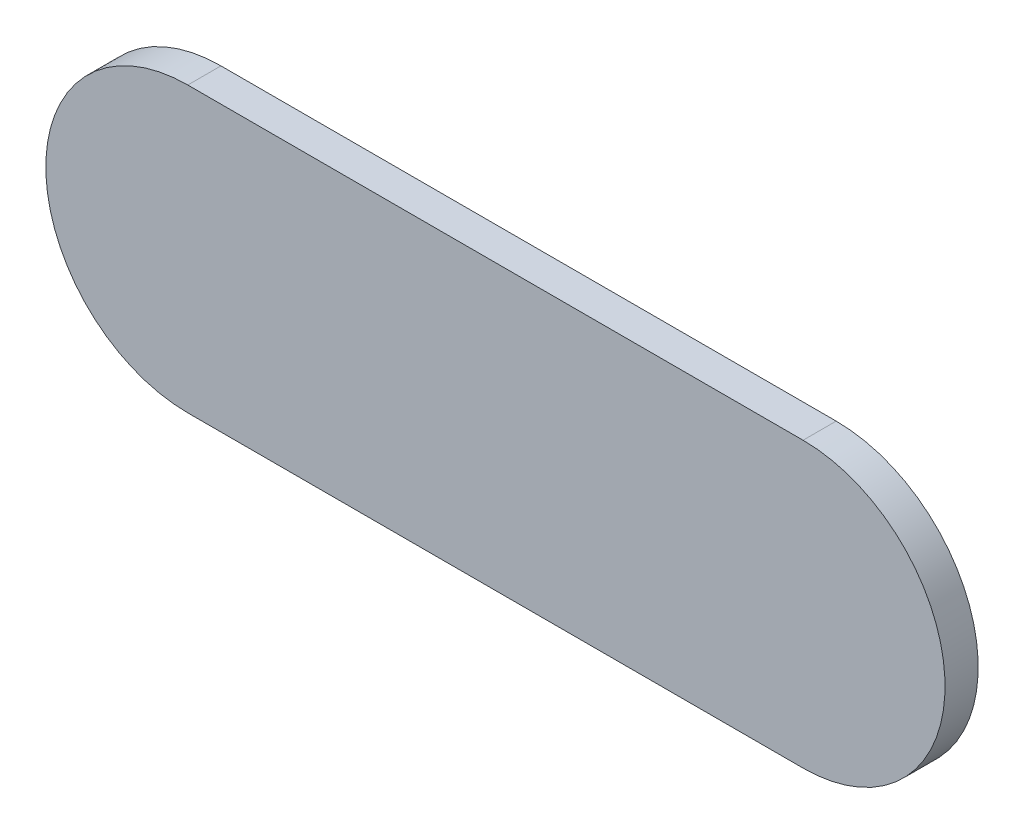
ISO-10303-21;
HEADER;
FILE_DESCRIPTION(('STEP AP214'),'2;1');
FILE_NAME('part.step','',(''),(''),'','','');
FILE_SCHEMA(('AUTOMOTIVE_DESIGN { 1 0 10303 214 1 1 1 1 }'));
ENDSEC;
DATA;
#1=APPLICATION_CONTEXT('core data for automotive mechanical design processes');
#2=APPLICATION_PROTOCOL_DEFINITION('international standard','automotive_design',2000,#1);
#3=PRODUCT_CONTEXT('',#1,'mechanical');
#4=PRODUCT('Part','Part','',(#3));
#5=PRODUCT_RELATED_PRODUCT_CATEGORY('part','',(#4));
#6=PRODUCT_DEFINITION_FORMATION('','',#4);
#7=PRODUCT_DEFINITION_CONTEXT('part definition',#1,'design');
#8=PRODUCT_DEFINITION('design','',#6,#7);
#9=PRODUCT_DEFINITION_SHAPE('','',#8);
#10=(LENGTH_UNIT() NAMED_UNIT(*) SI_UNIT(.MILLI.,.METRE.));
#11=(NAMED_UNIT(*) PLANE_ANGLE_UNIT() SI_UNIT($,.RADIAN.));
#12=(NAMED_UNIT(*) SI_UNIT($,.STERADIAN.) SOLID_ANGLE_UNIT());
#13=UNCERTAINTY_MEASURE_WITH_UNIT(LENGTH_MEASURE(1.E-05),#10,'distance_accuracy_value','');
#14=(GEOMETRIC_REPRESENTATION_CONTEXT(3) GLOBAL_UNCERTAINTY_ASSIGNED_CONTEXT((#13)) GLOBAL_UNIT_ASSIGNED_CONTEXT((#10,
#11,#12)) REPRESENTATION_CONTEXT('',''));
#15=CARTESIAN_POINT('',(0.,0.,0.));
#16=DIRECTION('',(0.,0.,1.));
#17=DIRECTION('',(1.,0.,0.));
#18=AXIS2_PLACEMENT_3D('',#15,#16,#17);
#19=CARTESIAN_POINT('',(133.818,-117.904,1.635));
#20=DIRECTION('',(0.,0.,1.));
#21=DIRECTION('',(1.,0.,0.));
#22=AXIS2_PLACEMENT_3D('',#19,#20,#21);
#23=PLANE('',#22);
#24=DIRECTION('',(-1.,0.,0.));
#25=VECTOR('',#24,1.);
#26=CARTESIAN_POINT('',(133.818,-117.904,1.635));
#27=LINE('',#26,#25);
#28=CARTESIAN_POINT('',(133.818,-117.904,1.635));
#29=VERTEX_POINT('',#28);
#30=CARTESIAN_POINT('',(133.168,-117.904,1.635));
#31=VERTEX_POINT('',#30);
#32=EDGE_CURVE('E82',#29,#31,#27,.T.);
#33=ORIENTED_EDGE('',*,*,#32,.T.);
#34=CARTESIAN_POINT('',(133.168,-118.054,1.635));
#35=DIRECTION('',(0.,0.,1.));
#36=DIRECTION('',(0.,1.,0.));
#37=AXIS2_PLACEMENT_3D('',#34,#35,#36);
#38=CIRCLE('',#37,0.15);
#39=CARTESIAN_POINT('',(133.168,-118.204,1.635));
#40=VERTEX_POINT('',#39);
#41=EDGE_CURVE('E99',#31,#40,#38,.T.);
#42=ORIENTED_EDGE('',*,*,#41,.T.);
#43=DIRECTION('',(1.,0.,0.));
#44=VECTOR('',#43,1.);
#45=CARTESIAN_POINT('',(133.168,-118.204,1.635));
#46=LINE('',#45,#44);
#47=CARTESIAN_POINT('',(133.818,-118.204,1.635));
#48=VERTEX_POINT('',#47);
#49=EDGE_CURVE('E75',#40,#48,#46,.T.);
#50=ORIENTED_EDGE('',*,*,#49,.T.);
#51=CARTESIAN_POINT('',(133.818,-118.054,1.635));
#52=DIRECTION('',(0.,0.,1.));
#53=DIRECTION('',(1.894780628694E-13,-1.,0.));
#54=AXIS2_PLACEMENT_3D('',#51,#52,#53);
#55=CIRCLE('',#54,0.15);
#56=EDGE_CURVE('E11',#48,#29,#55,.T.);
#57=ORIENTED_EDGE('',*,*,#56,.T.);
#58=EDGE_LOOP('',(#33,#42,#50,#57));
#59=FACE_BOUND('',#58,.T.);
#60=ADVANCED_FACE('F17',(#59),#23,.T.);
#61=CARTESIAN_POINT('',(133.818,-117.904,1.6));
#62=DIRECTION('',(0.,0.,1.));
#63=DIRECTION('',(1.,0.,0.));
#64=AXIS2_PLACEMENT_3D('',#61,#62,#63);
#65=PLANE('',#64);
#66=CARTESIAN_POINT('',(133.818,-118.054,1.6));
#67=DIRECTION('',(0.,0.,1.));
#68=DIRECTION('',(1.894780628694E-13,-1.,0.));
#69=AXIS2_PLACEMENT_3D('',#66,#67,#68);
#70=CIRCLE('',#69,0.15);
#71=CARTESIAN_POINT('',(133.818,-118.204,1.6));
#72=VERTEX_POINT('',#71);
#73=CARTESIAN_POINT('',(133.818,-117.904,1.6));
#74=VERTEX_POINT('',#73);
#75=EDGE_CURVE('E20',#72,#74,#70,.T.);
#76=ORIENTED_EDGE('',*,*,#75,.F.);
#77=DIRECTION('',(1.,0.,0.));
#78=VECTOR('',#77,1.);
#79=CARTESIAN_POINT('',(133.168,-118.204,1.6));
#80=LINE('',#79,#78);
#81=CARTESIAN_POINT('',(133.168,-118.204,1.6));
#82=VERTEX_POINT('',#81);
#83=EDGE_CURVE('E102',#82,#72,#80,.T.);
#84=ORIENTED_EDGE('',*,*,#83,.F.);
#85=CARTESIAN_POINT('',(133.168,-118.054,1.6));
#86=DIRECTION('',(0.,0.,1.));
#87=DIRECTION('',(0.,1.,0.));
#88=AXIS2_PLACEMENT_3D('',#85,#86,#87);
#89=CIRCLE('',#88,0.15);
#90=CARTESIAN_POINT('',(133.168,-117.904,1.6));
#91=VERTEX_POINT('',#90);
#92=EDGE_CURVE('E84',#91,#82,#89,.T.);
#93=ORIENTED_EDGE('',*,*,#92,.F.);
#94=DIRECTION('',(-1.,0.,0.));
#95=VECTOR('',#94,1.);
#96=CARTESIAN_POINT('',(133.818,-117.904,1.6));
#97=LINE('',#96,#95);
#98=EDGE_CURVE('E80',#74,#91,#97,.T.);
#99=ORIENTED_EDGE('',*,*,#98,.F.);
#100=EDGE_LOOP('',(#76,#84,#93,#99));
#101=FACE_BOUND('',#100,.T.);
#102=ADVANCED_FACE('F86',(#101),#65,.F.);
#103=CARTESIAN_POINT('',(133.818,-118.054,1.6));
#104=DIRECTION('',(0.,0.,-1.));
#105=DIRECTION('',(1.894780628694E-13,-1.,0.));
#106=AXIS2_PLACEMENT_3D('',#103,#104,#105);
#107=CYLINDRICAL_SURFACE('',#106,0.15);
#108=ORIENTED_EDGE('',*,*,#75,.T.);
#109=DIRECTION('',(0.,0.,1.));
#110=VECTOR('',#109,1.);
#111=CARTESIAN_POINT('',(133.818,-117.904,1.6));
#112=LINE('',#111,#110);
#113=EDGE_CURVE('E69',#74,#29,#112,.T.);
#114=ORIENTED_EDGE('',*,*,#113,.T.);
#115=ORIENTED_EDGE('',*,*,#56,.F.);
#116=DIRECTION('',(0.,0.,1.));
#117=VECTOR('',#116,1.);
#118=CARTESIAN_POINT('',(133.818,-118.204,1.6));
#119=LINE('',#118,#117);
#120=EDGE_CURVE('E72',#72,#48,#119,.T.);
#121=ORIENTED_EDGE('',*,*,#120,.F.);
#122=EDGE_LOOP('',(#108,#114,#115,#121));
#123=FACE_BOUND('',#122,.T.);
#124=ADVANCED_FACE('F68',(#123),#107,.T.);
#125=CARTESIAN_POINT('',(133.168,-118.204,1.6));
#126=DIRECTION('',(0.,1.,0.));
#127=DIRECTION('',(1.,0.,0.));
#128=AXIS2_PLACEMENT_3D('',#125,#126,#127);
#129=PLANE('',#128);
#130=ORIENTED_EDGE('',*,*,#83,.T.);
#131=ORIENTED_EDGE('',*,*,#120,.T.);
#132=ORIENTED_EDGE('',*,*,#49,.F.);
#133=DIRECTION('',(0.,0.,1.));
#134=VECTOR('',#133,1.);
#135=CARTESIAN_POINT('',(133.168,-118.204,1.6));
#136=LINE('',#135,#134);
#137=EDGE_CURVE('E103',#82,#40,#136,.T.);
#138=ORIENTED_EDGE('',*,*,#137,.F.);
#139=EDGE_LOOP('',(#130,#131,#132,#138));
#140=FACE_BOUND('',#139,.T.);
#141=ADVANCED_FACE('F119',(#140),#129,.F.);
#142=CARTESIAN_POINT('',(133.168,-118.054,1.6));
#143=DIRECTION('',(0.,0.,-1.));
#144=DIRECTION('',(0.,1.,0.));
#145=AXIS2_PLACEMENT_3D('',#142,#143,#144);
#146=CYLINDRICAL_SURFACE('',#145,0.15);
#147=ORIENTED_EDGE('',*,*,#92,.T.);
#148=ORIENTED_EDGE('',*,*,#137,.T.);
#149=ORIENTED_EDGE('',*,*,#41,.F.);
#150=DIRECTION('',(0.,0.,1.));
#151=VECTOR('',#150,1.);
#152=CARTESIAN_POINT('',(133.168,-117.904,1.6));
#153=LINE('',#152,#151);
#154=EDGE_CURVE('E90',#91,#31,#153,.T.);
#155=ORIENTED_EDGE('',*,*,#154,.F.);
#156=EDGE_LOOP('',(#147,#148,#149,#155));
#157=FACE_BOUND('',#156,.T.);
#158=ADVANCED_FACE('F121',(#157),#146,.T.);
#159=CARTESIAN_POINT('',(133.818,-117.904,1.6));
#160=DIRECTION('',(0.,-1.,0.));
#161=DIRECTION('',(0.,0.,-1.));
#162=AXIS2_PLACEMENT_3D('',#159,#160,#161);
#163=PLANE('',#162);
#164=ORIENTED_EDGE('',*,*,#98,.T.);
#165=ORIENTED_EDGE('',*,*,#154,.T.);
#166=ORIENTED_EDGE('',*,*,#32,.F.);
#167=ORIENTED_EDGE('',*,*,#113,.F.);
#168=EDGE_LOOP('',(#164,#165,#166,#167));
#169=FACE_BOUND('',#168,.T.);
#170=ADVANCED_FACE('F78',(#169),#163,.F.);
#171=CLOSED_SHELL('',(#60,#102,#124,#141,#158,#170));
#172=MANIFOLD_SOLID_BREP('B1',#171);
#173=ADVANCED_BREP_SHAPE_REPRESENTATION('',(#18,#172),#14);
#174=SHAPE_DEFINITION_REPRESENTATION(#9,#173);
ENDSEC;
END-ISO-10303-21;
